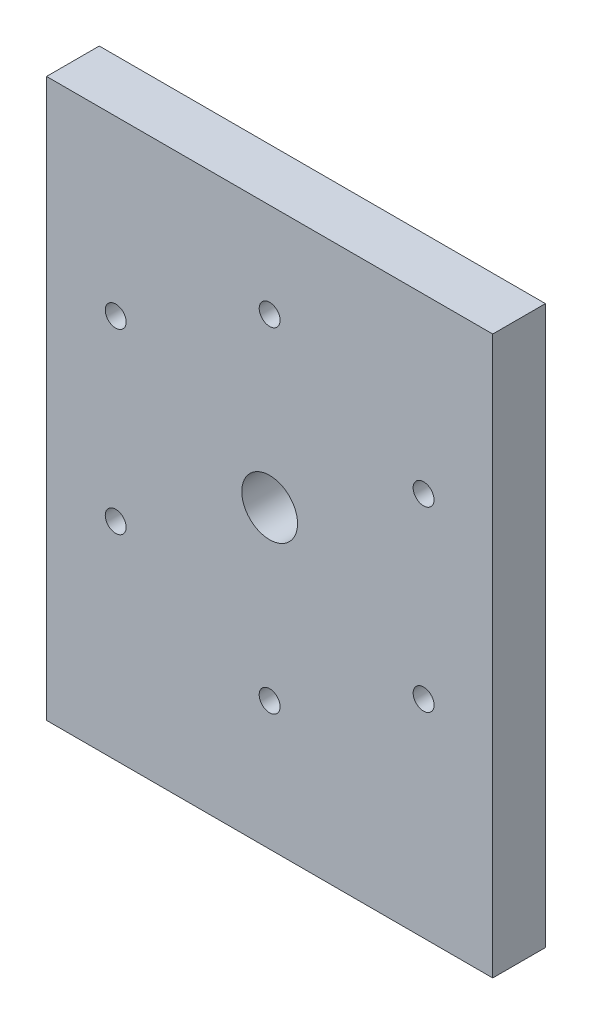
ISO-10303-21;
HEADER;
FILE_DESCRIPTION(('STEP AP214'),'2;1');
FILE_NAME('part.step','',(''),(''),'','','');
FILE_SCHEMA(('AUTOMOTIVE_DESIGN { 1 0 10303 214 1 1 1 1 }'));
ENDSEC;
DATA;
#1=APPLICATION_CONTEXT('core data for automotive mechanical design processes');
#2=APPLICATION_PROTOCOL_DEFINITION('international standard','automotive_design',2000,#1);
#3=PRODUCT_CONTEXT('',#1,'mechanical');
#4=PRODUCT('Part','Part','',(#3));
#5=PRODUCT_RELATED_PRODUCT_CATEGORY('part','',(#4));
#6=PRODUCT_DEFINITION_FORMATION('','',#4);
#7=PRODUCT_DEFINITION_CONTEXT('part definition',#1,'design');
#8=PRODUCT_DEFINITION('design','',#6,#7);
#9=PRODUCT_DEFINITION_SHAPE('','',#8);
#10=(LENGTH_UNIT() NAMED_UNIT(*) SI_UNIT(.MILLI.,.METRE.));
#11=(NAMED_UNIT(*) PLANE_ANGLE_UNIT() SI_UNIT($,.RADIAN.));
#12=(NAMED_UNIT(*) SI_UNIT($,.STERADIAN.) SOLID_ANGLE_UNIT());
#13=UNCERTAINTY_MEASURE_WITH_UNIT(LENGTH_MEASURE(1.E-05),#10,'distance_accuracy_value','');
#14=(GEOMETRIC_REPRESENTATION_CONTEXT(3) GLOBAL_UNCERTAINTY_ASSIGNED_CONTEXT((#13)) GLOBAL_UNIT_ASSIGNED_CONTEXT((#10,
#11,#12)) REPRESENTATION_CONTEXT('',''));
#15=CARTESIAN_POINT('',(0.,0.,0.));
#16=DIRECTION('',(0.,0.,1.));
#17=DIRECTION('',(1.,0.,0.));
#18=AXIS2_PLACEMENT_3D('',#15,#16,#17);
#19=CARTESIAN_POINT('',(0.,0.,12.0000014));
#20=DIRECTION('',(0.,0.,1.));
#21=DIRECTION('',(1.,0.,0.));
#22=AXIS2_PLACEMENT_3D('',#19,#20,#21);
#23=PLANE('',#22);
#24=CARTESIAN_POINT('',(0.,105.4749986,12.0000014));
#25=DIRECTION('',(0.,0.,-1.));
#26=DIRECTION('',(-1.,0.,0.));
#27=AXIS2_PLACEMENT_3D('',#24,#25,#26);
#28=CIRCLE('',#27,2.38125);
#29=CARTESIAN_POINT('',(-2.38125,105.4749986,12.0000014));
#30=VERTEX_POINT('',#29);
#31=EDGE_CURVE('E122',#30,#30,#28,.T.);
#32=ORIENTED_EDGE('',*,*,#31,.T.);
#33=EDGE_LOOP('',(#32));
#34=FACE_BOUND('',#33,.T.);
#35=CARTESIAN_POINT('',(-35.0577908769488,87.6156236,12.0000014));
#36=DIRECTION('',(0.,0.,-1.));
#37=DIRECTION('',(-1.,0.,0.));
#38=AXIS2_PLACEMENT_3D('',#35,#36,#37);
#39=CIRCLE('',#38,2.38125);
#40=CARTESIAN_POINT('',(-37.4390408769488,87.6156236,12.0000014));
#41=VERTEX_POINT('',#40);
#42=EDGE_CURVE('E130',#41,#41,#39,.T.);
#43=ORIENTED_EDGE('',*,*,#42,.T.);
#44=EDGE_LOOP('',(#43));
#45=FACE_BOUND('',#44,.T.);
#46=CARTESIAN_POINT('',(0.,29.2749986,12.0000014));
#47=DIRECTION('',(0.,0.,-1.));
#48=DIRECTION('',(-1.,0.,0.));
#49=AXIS2_PLACEMENT_3D('',#46,#47,#48);
#50=CIRCLE('',#49,2.38125);
#51=CARTESIAN_POINT('',(-2.38125,29.2749986,12.0000014));
#52=VERTEX_POINT('',#51);
#53=EDGE_CURVE('E129',#52,#52,#50,.T.);
#54=ORIENTED_EDGE('',*,*,#53,.T.);
#55=EDGE_LOOP('',(#54));
#56=FACE_BOUND('',#55,.T.);
#57=CARTESIAN_POINT('',(35.0577908769488,87.6156236,12.0000014));
#58=DIRECTION('',(0.,0.,-1.));
#59=DIRECTION('',(-1.,0.,0.));
#60=AXIS2_PLACEMENT_3D('',#57,#58,#59);
#61=CIRCLE('',#60,2.38125);
#62=CARTESIAN_POINT('',(32.6765408769488,87.6156236,12.0000014));
#63=VERTEX_POINT('',#62);
#64=EDGE_CURVE('E153',#63,#63,#61,.T.);
#65=ORIENTED_EDGE('',*,*,#64,.T.);
#66=EDGE_LOOP('',(#65));
#67=FACE_BOUND('',#66,.T.);
#68=CARTESIAN_POINT('',(35.0577908769488,47.1343736,12.0000014));
#69=DIRECTION('',(0.,0.,-1.));
#70=DIRECTION('',(-1.,0.,0.));
#71=AXIS2_PLACEMENT_3D('',#68,#69,#70);
#72=CIRCLE('',#71,2.38125);
#73=CARTESIAN_POINT('',(32.6765408769488,47.1343736,12.0000014));
#74=VERTEX_POINT('',#73);
#75=EDGE_CURVE('E136',#74,#74,#72,.T.);
#76=ORIENTED_EDGE('',*,*,#75,.T.);
#77=EDGE_LOOP('',(#76));
#78=FACE_BOUND('',#77,.T.);
#79=CARTESIAN_POINT('',(-35.0577908769488,47.1343736,12.0000014));
#80=DIRECTION('',(0.,0.,-1.));
#81=DIRECTION('',(-1.,0.,0.));
#82=AXIS2_PLACEMENT_3D('',#79,#80,#81);
#83=CIRCLE('',#82,2.38125);
#84=CARTESIAN_POINT('',(-37.4390408769488,47.1343736,12.0000014));
#85=VERTEX_POINT('',#84);
#86=EDGE_CURVE('E143',#85,#85,#83,.T.);
#87=ORIENTED_EDGE('',*,*,#86,.T.);
#88=EDGE_LOOP('',(#87));
#89=FACE_BOUND('',#88,.T.);
#90=DIRECTION('',(0.,-1.,0.));
#91=VECTOR('',#90,1.);
#92=CARTESIAN_POINT('',(-50.8,127.,12.0000014));
#93=LINE('',#92,#91);
#94=CARTESIAN_POINT('',(-50.8,127.,12.0000014));
#95=VERTEX_POINT('',#94);
#96=CARTESIAN_POINT('',(-50.7999999999999,0.,12.0000014));
#97=VERTEX_POINT('',#96);
#98=EDGE_CURVE('E164',#95,#97,#93,.T.);
#99=ORIENTED_EDGE('',*,*,#98,.T.);
#100=DIRECTION('',(1.,0.,0.));
#101=VECTOR('',#100,1.);
#102=CARTESIAN_POINT('',(-50.7999999999999,0.,12.0000014));
#103=LINE('',#102,#101);
#104=CARTESIAN_POINT('',(50.8,0.,12.0000014));
#105=VERTEX_POINT('',#104);
#106=EDGE_CURVE('E84',#97,#105,#103,.T.);
#107=ORIENTED_EDGE('',*,*,#106,.T.);
#108=DIRECTION('',(0.,1.,0.));
#109=VECTOR('',#108,1.);
#110=CARTESIAN_POINT('',(50.8,127.,12.0000014));
#111=LINE('',#110,#109);
#112=CARTESIAN_POINT('',(50.8,127.,12.0000014));
#113=VERTEX_POINT('',#112);
#114=EDGE_CURVE('E167',#105,#113,#111,.T.);
#115=ORIENTED_EDGE('',*,*,#114,.T.);
#116=DIRECTION('',(-1.,0.,0.));
#117=VECTOR('',#116,1.);
#118=CARTESIAN_POINT('',(-50.8,127.,12.0000014));
#119=LINE('',#118,#117);
#120=EDGE_CURVE('E53',#113,#95,#119,.T.);
#121=ORIENTED_EDGE('',*,*,#120,.T.);
#122=EDGE_LOOP('',(#99,#107,#115,#121));
#123=FACE_BOUND('',#122,.T.);
#124=CARTESIAN_POINT('',(0.,67.3749986,12.0000014));
#125=DIRECTION('',(0.,0.,1.));
#126=DIRECTION('',(1.,0.,0.));
#127=AXIS2_PLACEMENT_3D('',#124,#125,#126);
#128=CIRCLE('',#127,6.35);
#129=CARTESIAN_POINT('',(6.35,67.3749986,12.0000014));
#130=VERTEX_POINT('',#129);
#131=EDGE_CURVE('E158',#130,#130,#128,.T.);
#132=ORIENTED_EDGE('',*,*,#131,.F.);
#133=EDGE_LOOP('',(#132));
#134=FACE_BOUND('',#133,.T.);
#135=ADVANCED_FACE('F36',(#34,#45,#56,#67,#78,#89,#123,#134),#23,.T.);
#136=CARTESIAN_POINT('',(0.,0.,0.));
#137=DIRECTION('',(0.,0.,1.));
#138=DIRECTION('',(1.,0.,0.));
#139=AXIS2_PLACEMENT_3D('',#136,#137,#138);
#140=PLANE('',#139);
#141=CARTESIAN_POINT('',(0.,105.4749986,0.));
#142=DIRECTION('',(0.,0.,-1.));
#143=DIRECTION('',(-1.,0.,0.));
#144=AXIS2_PLACEMENT_3D('',#141,#142,#143);
#145=CIRCLE('',#144,2.38125);
#146=CARTESIAN_POINT('',(-2.38125,105.4749986,0.));
#147=VERTEX_POINT('',#146);
#148=EDGE_CURVE('E126',#147,#147,#145,.T.);
#149=ORIENTED_EDGE('',*,*,#148,.F.);
#150=EDGE_LOOP('',(#149));
#151=FACE_BOUND('',#150,.T.);
#152=CARTESIAN_POINT('',(-35.0577908769488,87.6156236,0.));
#153=DIRECTION('',(0.,0.,-1.));
#154=DIRECTION('',(-1.,0.,0.));
#155=AXIS2_PLACEMENT_3D('',#152,#153,#154);
#156=CIRCLE('',#155,2.38125);
#157=CARTESIAN_POINT('',(-37.4390408769488,87.6156236,0.));
#158=VERTEX_POINT('',#157);
#159=EDGE_CURVE('E121',#158,#158,#156,.T.);
#160=ORIENTED_EDGE('',*,*,#159,.F.);
#161=EDGE_LOOP('',(#160));
#162=FACE_BOUND('',#161,.T.);
#163=CARTESIAN_POINT('',(0.,29.2749986,0.));
#164=DIRECTION('',(0.,0.,-1.));
#165=DIRECTION('',(-1.,0.,0.));
#166=AXIS2_PLACEMENT_3D('',#163,#164,#165);
#167=CIRCLE('',#166,2.38125);
#168=CARTESIAN_POINT('',(-2.38125,29.2749986,0.));
#169=VERTEX_POINT('',#168);
#170=EDGE_CURVE('E150',#169,#169,#167,.T.);
#171=ORIENTED_EDGE('',*,*,#170,.F.);
#172=EDGE_LOOP('',(#171));
#173=FACE_BOUND('',#172,.T.);
#174=CARTESIAN_POINT('',(35.0577908769488,87.6156236,0.));
#175=DIRECTION('',(0.,0.,-1.));
#176=DIRECTION('',(-1.,0.,0.));
#177=AXIS2_PLACEMENT_3D('',#174,#175,#176);
#178=CIRCLE('',#177,2.38125);
#179=CARTESIAN_POINT('',(32.6765408769488,87.6156236,0.));
#180=VERTEX_POINT('',#179);
#181=EDGE_CURVE('E139',#180,#180,#178,.T.);
#182=ORIENTED_EDGE('',*,*,#181,.F.);
#183=EDGE_LOOP('',(#182));
#184=FACE_BOUND('',#183,.T.);
#185=CARTESIAN_POINT('',(35.0577908769488,47.1343736,0.));
#186=DIRECTION('',(0.,0.,-1.));
#187=DIRECTION('',(-1.,0.,0.));
#188=AXIS2_PLACEMENT_3D('',#185,#186,#187);
#189=CIRCLE('',#188,2.38125);
#190=CARTESIAN_POINT('',(32.6765408769488,47.1343736,0.));
#191=VERTEX_POINT('',#190);
#192=EDGE_CURVE('E140',#191,#191,#189,.T.);
#193=ORIENTED_EDGE('',*,*,#192,.F.);
#194=EDGE_LOOP('',(#193));
#195=FACE_BOUND('',#194,.T.);
#196=CARTESIAN_POINT('',(-35.0577908769488,47.1343736,0.));
#197=DIRECTION('',(0.,0.,-1.));
#198=DIRECTION('',(-1.,0.,0.));
#199=AXIS2_PLACEMENT_3D('',#196,#197,#198);
#200=CIRCLE('',#199,2.38125);
#201=CARTESIAN_POINT('',(-37.4390408769488,47.1343736,0.));
#202=VERTEX_POINT('',#201);
#203=EDGE_CURVE('E133',#202,#202,#200,.T.);
#204=ORIENTED_EDGE('',*,*,#203,.F.);
#205=EDGE_LOOP('',(#204));
#206=FACE_BOUND('',#205,.T.);
#207=DIRECTION('',(0.,-1.,0.));
#208=VECTOR('',#207,1.);
#209=CARTESIAN_POINT('',(-50.8,127.,0.));
#210=LINE('',#209,#208);
#211=CARTESIAN_POINT('',(-50.8,127.,0.));
#212=VERTEX_POINT('',#211);
#213=CARTESIAN_POINT('',(-50.7999999999999,0.,0.));
#214=VERTEX_POINT('',#213);
#215=EDGE_CURVE('E161',#212,#214,#210,.T.);
#216=ORIENTED_EDGE('',*,*,#215,.F.);
#217=DIRECTION('',(-1.,0.,0.));
#218=VECTOR('',#217,1.);
#219=CARTESIAN_POINT('',(-50.8,127.,0.));
#220=LINE('',#219,#218);
#221=CARTESIAN_POINT('',(50.8,127.,0.));
#222=VERTEX_POINT('',#221);
#223=EDGE_CURVE('E77',#222,#212,#220,.T.);
#224=ORIENTED_EDGE('',*,*,#223,.F.);
#225=DIRECTION('',(0.,1.,0.));
#226=VECTOR('',#225,1.);
#227=CARTESIAN_POINT('',(50.8,127.,0.));
#228=LINE('',#227,#226);
#229=CARTESIAN_POINT('',(50.8,0.,0.));
#230=VERTEX_POINT('',#229);
#231=EDGE_CURVE('E71',#230,#222,#228,.T.);
#232=ORIENTED_EDGE('',*,*,#231,.F.);
#233=DIRECTION('',(1.,0.,0.));
#234=VECTOR('',#233,1.);
#235=CARTESIAN_POINT('',(-50.7999999999999,0.,0.));
#236=LINE('',#235,#234);
#237=EDGE_CURVE('E173',#214,#230,#236,.T.);
#238=ORIENTED_EDGE('',*,*,#237,.F.);
#239=EDGE_LOOP('',(#216,#224,#232,#238));
#240=FACE_BOUND('',#239,.T.);
#241=CARTESIAN_POINT('',(0.,67.3749986,0.));
#242=DIRECTION('',(0.,0.,1.));
#243=DIRECTION('',(1.,0.,0.));
#244=AXIS2_PLACEMENT_3D('',#241,#242,#243);
#245=CIRCLE('',#244,6.35);
#246=CARTESIAN_POINT('',(6.35,67.3749986,0.));
#247=VERTEX_POINT('',#246);
#248=EDGE_CURVE('E125',#247,#247,#245,.T.);
#249=ORIENTED_EDGE('',*,*,#248,.T.);
#250=EDGE_LOOP('',(#249));
#251=FACE_BOUND('',#250,.T.);
#252=ADVANCED_FACE('F183',(#151,#162,#173,#184,#195,#206,#240,#251),#140,.F.);
#253=CARTESIAN_POINT('',(-50.8,127.,12.0000014));
#254=DIRECTION('',(1.,0.,0.));
#255=DIRECTION('',(0.,1.,0.));
#256=AXIS2_PLACEMENT_3D('',#253,#254,#255);
#257=PLANE('',#256);
#258=ORIENTED_EDGE('',*,*,#215,.T.);
#259=DIRECTION('',(0.,0.,-1.));
#260=VECTOR('',#259,1.);
#261=CARTESIAN_POINT('',(-50.7999999999999,0.,12.0000014));
#262=LINE('',#261,#260);
#263=EDGE_CURVE('E11',#97,#214,#262,.T.);
#264=ORIENTED_EDGE('',*,*,#263,.F.);
#265=ORIENTED_EDGE('',*,*,#98,.F.);
#266=DIRECTION('',(0.,0.,-1.));
#267=VECTOR('',#266,1.);
#268=CARTESIAN_POINT('',(-50.8,127.,12.0000014));
#269=LINE('',#268,#267);
#270=EDGE_CURVE('E170',#95,#212,#269,.T.);
#271=ORIENTED_EDGE('',*,*,#270,.T.);
#272=EDGE_LOOP('',(#258,#264,#265,#271));
#273=FACE_BOUND('',#272,.T.);
#274=ADVANCED_FACE('F38',(#273),#257,.F.);
#275=CARTESIAN_POINT('',(-50.7999999999999,0.,12.0000014));
#276=DIRECTION('',(0.,1.,0.));
#277=DIRECTION('',(0.,0.,1.));
#278=AXIS2_PLACEMENT_3D('',#275,#276,#277);
#279=PLANE('',#278);
#280=CARTESIAN_POINT('',(31.75,0.,6.00000070000001));
#281=DIRECTION('',(0.,-1.,0.));
#282=DIRECTION('',(0.,0.,-1.));
#283=AXIS2_PLACEMENT_3D('',#280,#281,#282);
#284=CIRCLE('',#283,2.01929999999999);
#285=CARTESIAN_POINT('',(31.75,0.,3.98070070000002));
#286=VERTEX_POINT('',#285);
#287=EDGE_CURVE('E105',#286,#286,#284,.T.);
#288=ORIENTED_EDGE('',*,*,#287,.F.);
#289=EDGE_LOOP('',(#288));
#290=FACE_BOUND('',#289,.T.);
#291=CARTESIAN_POINT('',(0.,0.,6.00000070000001));
#292=DIRECTION('',(0.,-1.,0.));
#293=DIRECTION('',(0.,0.,-1.));
#294=AXIS2_PLACEMENT_3D('',#291,#292,#293);
#295=CIRCLE('',#294,2.01929999999999);
#296=CARTESIAN_POINT('',(0.,0.,3.98070070000002));
#297=VERTEX_POINT('',#296);
#298=EDGE_CURVE('E104',#297,#297,#295,.T.);
#299=ORIENTED_EDGE('',*,*,#298,.F.);
#300=EDGE_LOOP('',(#299));
#301=FACE_BOUND('',#300,.T.);
#302=CARTESIAN_POINT('',(-31.75,0.,6.00000069999999));
#303=DIRECTION('',(0.,-1.,0.));
#304=DIRECTION('',(0.,0.,-1.));
#305=AXIS2_PLACEMENT_3D('',#302,#303,#304);
#306=CIRCLE('',#305,2.01929999999999);
#307=CARTESIAN_POINT('',(-31.75,0.,3.9807007));
#308=VERTEX_POINT('',#307);
#309=EDGE_CURVE('E115',#308,#308,#306,.T.);
#310=ORIENTED_EDGE('',*,*,#309,.F.);
#311=EDGE_LOOP('',(#310));
#312=FACE_BOUND('',#311,.T.);
#313=ORIENTED_EDGE('',*,*,#237,.T.);
#314=DIRECTION('',(0.,0.,-1.));
#315=VECTOR('',#314,1.);
#316=CARTESIAN_POINT('',(50.8,0.,12.0000014));
#317=LINE('',#316,#315);
#318=EDGE_CURVE('E45',#105,#230,#317,.T.);
#319=ORIENTED_EDGE('',*,*,#318,.F.);
#320=ORIENTED_EDGE('',*,*,#106,.F.);
#321=ORIENTED_EDGE('',*,*,#263,.T.);
#322=EDGE_LOOP('',(#313,#319,#320,#321));
#323=FACE_BOUND('',#322,.T.);
#324=ADVANCED_FACE('F199',(#290,#301,#312,#323),#279,.F.);
#325=CARTESIAN_POINT('',(50.8,127.,12.0000014));
#326=DIRECTION('',(-1.,0.,0.));
#327=DIRECTION('',(0.,-1.,0.));
#328=AXIS2_PLACEMENT_3D('',#325,#326,#327);
#329=PLANE('',#328);
#330=ORIENTED_EDGE('',*,*,#231,.T.);
#331=DIRECTION('',(0.,0.,-1.));
#332=VECTOR('',#331,1.);
#333=CARTESIAN_POINT('',(50.8,127.,12.0000014));
#334=LINE('',#333,#332);
#335=EDGE_CURVE('E178',#113,#222,#334,.T.);
#336=ORIENTED_EDGE('',*,*,#335,.F.);
#337=ORIENTED_EDGE('',*,*,#114,.F.);
#338=ORIENTED_EDGE('',*,*,#318,.T.);
#339=EDGE_LOOP('',(#330,#336,#337,#338));
#340=FACE_BOUND('',#339,.T.);
#341=ADVANCED_FACE('F180',(#340),#329,.F.);
#342=CARTESIAN_POINT('',(-50.8,127.,12.0000014));
#343=DIRECTION('',(0.,-1.,0.));
#344=DIRECTION('',(0.,0.,-1.));
#345=AXIS2_PLACEMENT_3D('',#342,#343,#344);
#346=PLANE('',#345);
#347=ORIENTED_EDGE('',*,*,#223,.T.);
#348=ORIENTED_EDGE('',*,*,#270,.F.);
#349=ORIENTED_EDGE('',*,*,#120,.F.);
#350=ORIENTED_EDGE('',*,*,#335,.T.);
#351=EDGE_LOOP('',(#347,#348,#349,#350));
#352=FACE_BOUND('',#351,.T.);
#353=ADVANCED_FACE('F188',(#352),#346,.F.);
#354=CARTESIAN_POINT('',(0.,67.3749986,12.0000014));
#355=DIRECTION('',(0.,0.,-1.));
#356=DIRECTION('',(-1.,0.,0.));
#357=AXIS2_PLACEMENT_3D('',#354,#355,#356);
#358=CYLINDRICAL_SURFACE('',#357,6.35);
#359=ORIENTED_EDGE('',*,*,#131,.T.);
#360=EDGE_LOOP('',(#359));
#361=FACE_BOUND('',#360,.T.);
#362=ORIENTED_EDGE('',*,*,#248,.F.);
#363=EDGE_LOOP('',(#362));
#364=FACE_BOUND('',#363,.T.);
#365=ADVANCED_FACE('F190',(#361,#364),#358,.F.);
#366=CARTESIAN_POINT('',(-35.0577908769488,47.1343736,12.0000014));
#367=DIRECTION('',(0.,0.,-1.));
#368=DIRECTION('',(-1.,0.,0.));
#369=AXIS2_PLACEMENT_3D('',#366,#367,#368);
#370=CYLINDRICAL_SURFACE('',#369,2.38125);
#371=ORIENTED_EDGE('',*,*,#86,.F.);
#372=EDGE_LOOP('',(#371));
#373=FACE_BOUND('',#372,.T.);
#374=ORIENTED_EDGE('',*,*,#203,.T.);
#375=EDGE_LOOP('',(#374));
#376=FACE_BOUND('',#375,.T.);
#377=ADVANCED_FACE('F196',(#373,#376),#370,.F.);
#378=CARTESIAN_POINT('',(35.0577908769488,47.1343736,12.0000014));
#379=DIRECTION('',(0.,0.,-1.));
#380=DIRECTION('',(-1.,0.,0.));
#381=AXIS2_PLACEMENT_3D('',#378,#379,#380);
#382=CYLINDRICAL_SURFACE('',#381,2.38125);
#383=ORIENTED_EDGE('',*,*,#75,.F.);
#384=EDGE_LOOP('',(#383));
#385=FACE_BOUND('',#384,.T.);
#386=ORIENTED_EDGE('',*,*,#192,.T.);
#387=EDGE_LOOP('',(#386));
#388=FACE_BOUND('',#387,.T.);
#389=ADVANCED_FACE('F215',(#385,#388),#382,.F.);
#390=CARTESIAN_POINT('',(35.0577908769488,87.6156236,12.0000014));
#391=DIRECTION('',(0.,0.,-1.));
#392=DIRECTION('',(-1.,0.,0.));
#393=AXIS2_PLACEMENT_3D('',#390,#391,#392);
#394=CYLINDRICAL_SURFACE('',#393,2.38125);
#395=ORIENTED_EDGE('',*,*,#64,.F.);
#396=EDGE_LOOP('',(#395));
#397=FACE_BOUND('',#396,.T.);
#398=ORIENTED_EDGE('',*,*,#181,.T.);
#399=EDGE_LOOP('',(#398));
#400=FACE_BOUND('',#399,.T.);
#401=ADVANCED_FACE('F211',(#397,#400),#394,.F.);
#402=CARTESIAN_POINT('',(0.,29.2749986,12.0000014));
#403=DIRECTION('',(0.,0.,-1.));
#404=DIRECTION('',(-1.,0.,0.));
#405=AXIS2_PLACEMENT_3D('',#402,#403,#404);
#406=CYLINDRICAL_SURFACE('',#405,2.38125);
#407=ORIENTED_EDGE('',*,*,#53,.F.);
#408=EDGE_LOOP('',(#407));
#409=FACE_BOUND('',#408,.T.);
#410=ORIENTED_EDGE('',*,*,#170,.T.);
#411=EDGE_LOOP('',(#410));
#412=FACE_BOUND('',#411,.T.);
#413=ADVANCED_FACE('F214',(#409,#412),#406,.F.);
#414=CARTESIAN_POINT('',(-35.0577908769488,87.6156236,12.0000014));
#415=DIRECTION('',(0.,0.,-1.));
#416=DIRECTION('',(-1.,0.,0.));
#417=AXIS2_PLACEMENT_3D('',#414,#415,#416);
#418=CYLINDRICAL_SURFACE('',#417,2.38125);
#419=ORIENTED_EDGE('',*,*,#42,.F.);
#420=EDGE_LOOP('',(#419));
#421=FACE_BOUND('',#420,.T.);
#422=ORIENTED_EDGE('',*,*,#159,.T.);
#423=EDGE_LOOP('',(#422));
#424=FACE_BOUND('',#423,.T.);
#425=ADVANCED_FACE('F219',(#421,#424),#418,.F.);
#426=CARTESIAN_POINT('',(0.,105.4749986,12.0000014));
#427=DIRECTION('',(0.,0.,-1.));
#428=DIRECTION('',(-1.,0.,0.));
#429=AXIS2_PLACEMENT_3D('',#426,#427,#428);
#430=CYLINDRICAL_SURFACE('',#429,2.38125);
#431=ORIENTED_EDGE('',*,*,#31,.F.);
#432=EDGE_LOOP('',(#431));
#433=FACE_BOUND('',#432,.T.);
#434=ORIENTED_EDGE('',*,*,#148,.T.);
#435=EDGE_LOOP('',(#434));
#436=FACE_BOUND('',#435,.T.);
#437=ADVANCED_FACE('F229',(#433,#436),#430,.F.);
#438=CARTESIAN_POINT('',(-31.75,12.7,6.00000069999999));
#439=DIRECTION('',(0.,-1.,0.));
#440=DIRECTION('',(0.,0.,-1.));
#441=AXIS2_PLACEMENT_3D('',#438,#439,#440);
#442=CONICAL_SURFACE('',#441,2.01929999999999,1.02974425867665);
#443=CARTESIAN_POINT('',(-31.75,13.9133178480024,6.00000069999999));
#444=VERTEX_POINT('',#443);
#445=VERTEX_LOOP('',#444);
#446=FACE_BOUND('',#445,.T.);
#447=CARTESIAN_POINT('',(-31.75,12.7,6.00000069999999));
#448=DIRECTION('',(0.,-1.,0.));
#449=DIRECTION('',(0.,0.,-1.));
#450=AXIS2_PLACEMENT_3D('',#447,#448,#449);
#451=CIRCLE('',#450,2.01929999999999);
#452=CARTESIAN_POINT('',(-31.75,12.7,3.9807007));
#453=VERTEX_POINT('',#452);
#454=EDGE_CURVE('E118',#453,#453,#451,.T.);
#455=ORIENTED_EDGE('',*,*,#454,.T.);
#456=EDGE_LOOP('',(#455));
#457=FACE_BOUND('',#456,.T.);
#458=ADVANCED_FACE('F233',(#446,#457),#442,.F.);
#459=CARTESIAN_POINT('',(-31.75,0.,6.00000069999999));
#460=DIRECTION('',(0.,-1.,0.));
#461=DIRECTION('',(0.,0.,-1.));
#462=AXIS2_PLACEMENT_3D('',#459,#460,#461);
#463=CYLINDRICAL_SURFACE('',#462,2.01929999999999);
#464=ORIENTED_EDGE('',*,*,#454,.F.);
#465=EDGE_LOOP('',(#464));
#466=FACE_BOUND('',#465,.T.);
#467=ORIENTED_EDGE('',*,*,#309,.T.);
#468=EDGE_LOOP('',(#467));
#469=FACE_BOUND('',#468,.T.);
#470=ADVANCED_FACE('F237',(#466,#469),#463,.F.);
#471=CARTESIAN_POINT('',(0.,12.7,6.00000070000001));
#472=DIRECTION('',(0.,-1.,0.));
#473=DIRECTION('',(0.,0.,-1.));
#474=AXIS2_PLACEMENT_3D('',#471,#472,#473);
#475=CONICAL_SURFACE('',#474,2.01929999999999,1.02974425867665);
#476=CARTESIAN_POINT('',(0.,13.9133178480024,6.00000070000001));
#477=VERTEX_POINT('',#476);
#478=VERTEX_LOOP('',#477);
#479=FACE_BOUND('',#478,.T.);
#480=CARTESIAN_POINT('',(0.,12.7,6.00000070000001));
#481=DIRECTION('',(0.,-1.,0.));
#482=DIRECTION('',(0.,0.,-1.));
#483=AXIS2_PLACEMENT_3D('',#480,#481,#482);
#484=CIRCLE('',#483,2.01929999999999);
#485=CARTESIAN_POINT('',(0.,12.7,3.98070070000002));
#486=VERTEX_POINT('',#485);
#487=EDGE_CURVE('E108',#486,#486,#484,.T.);
#488=ORIENTED_EDGE('',*,*,#487,.T.);
#489=EDGE_LOOP('',(#488));
#490=FACE_BOUND('',#489,.T.);
#491=ADVANCED_FACE('F241',(#479,#490),#475,.F.);
#492=CARTESIAN_POINT('',(0.,0.,6.00000070000001));
#493=DIRECTION('',(0.,-1.,0.));
#494=DIRECTION('',(0.,0.,-1.));
#495=AXIS2_PLACEMENT_3D('',#492,#493,#494);
#496=CYLINDRICAL_SURFACE('',#495,2.01929999999999);
#497=ORIENTED_EDGE('',*,*,#487,.F.);
#498=EDGE_LOOP('',(#497));
#499=FACE_BOUND('',#498,.T.);
#500=ORIENTED_EDGE('',*,*,#298,.T.);
#501=EDGE_LOOP('',(#500));
#502=FACE_BOUND('',#501,.T.);
#503=ADVANCED_FACE('F98',(#499,#502),#496,.F.);
#504=CARTESIAN_POINT('',(31.75,12.7,6.00000070000001));
#505=DIRECTION('',(0.,-1.,0.));
#506=DIRECTION('',(0.,0.,-1.));
#507=AXIS2_PLACEMENT_3D('',#504,#505,#506);
#508=CONICAL_SURFACE('',#507,2.01929999999999,1.02974425867665);
#509=CARTESIAN_POINT('',(31.75,13.9133178480024,6.00000070000001));
#510=VERTEX_POINT('',#509);
#511=VERTEX_LOOP('',#510);
#512=FACE_BOUND('',#511,.T.);
#513=CARTESIAN_POINT('',(31.75,12.7,6.00000070000001));
#514=DIRECTION('',(0.,-1.,0.));
#515=DIRECTION('',(0.,0.,-1.));
#516=AXIS2_PLACEMENT_3D('',#513,#514,#515);
#517=CIRCLE('',#516,2.01929999999999);
#518=CARTESIAN_POINT('',(31.75,12.7,3.98070070000002));
#519=VERTEX_POINT('',#518);
#520=EDGE_CURVE('E102',#519,#519,#517,.T.);
#521=ORIENTED_EDGE('',*,*,#520,.T.);
#522=EDGE_LOOP('',(#521));
#523=FACE_BOUND('',#522,.T.);
#524=ADVANCED_FACE('F94',(#512,#523),#508,.F.);
#525=CARTESIAN_POINT('',(31.75,0.,6.00000070000001));
#526=DIRECTION('',(0.,-1.,0.));
#527=DIRECTION('',(0.,0.,-1.));
#528=AXIS2_PLACEMENT_3D('',#525,#526,#527);
#529=CYLINDRICAL_SURFACE('',#528,2.01929999999999);
#530=ORIENTED_EDGE('',*,*,#520,.F.);
#531=EDGE_LOOP('',(#530));
#532=FACE_BOUND('',#531,.T.);
#533=ORIENTED_EDGE('',*,*,#287,.T.);
#534=EDGE_LOOP('',(#533));
#535=FACE_BOUND('',#534,.T.);
#536=ADVANCED_FACE('F97',(#532,#535),#529,.F.);
#537=CLOSED_SHELL('',(#135,#252,#274,#324,#341,#353,#365,#377,#389,#401,#413,#425,#437,#458,
#470,#491,#503,#524,#536));
#538=MANIFOLD_SOLID_BREP('B2',#537);
#539=ADVANCED_BREP_SHAPE_REPRESENTATION('',(#18,#538),#14);
#540=SHAPE_DEFINITION_REPRESENTATION(#9,#539);
ENDSEC;
END-ISO-10303-21;
